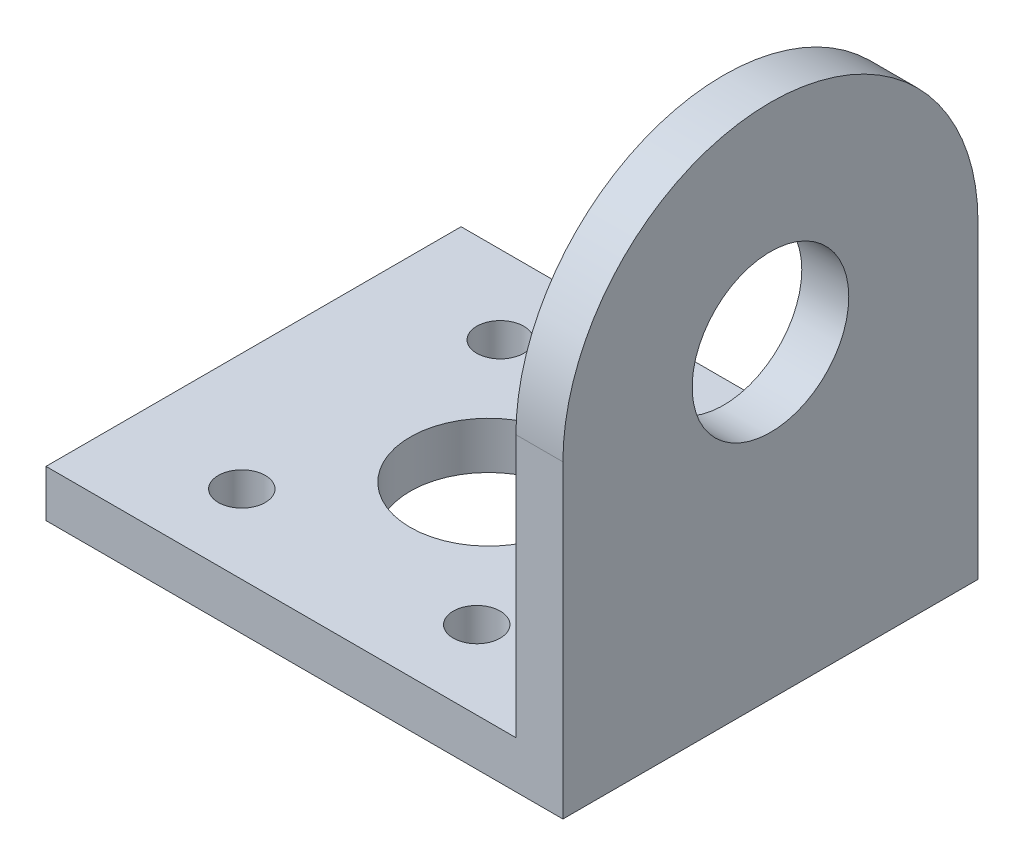
ISO-10303-21;
HEADER;
FILE_DESCRIPTION(('STEP AP214'),'2;1');
FILE_NAME('part.step','',(''),(''),'','','');
FILE_SCHEMA(('AUTOMOTIVE_DESIGN { 1 0 10303 214 1 1 1 1 }'));
ENDSEC;
DATA;
#1=APPLICATION_CONTEXT('core data for automotive mechanical design processes');
#2=APPLICATION_PROTOCOL_DEFINITION('international standard','automotive_design',2000,#1);
#3=PRODUCT_CONTEXT('',#1,'mechanical');
#4=PRODUCT('Part','Part','',(#3));
#5=PRODUCT_RELATED_PRODUCT_CATEGORY('part','',(#4));
#6=PRODUCT_DEFINITION_FORMATION('','',#4);
#7=PRODUCT_DEFINITION_CONTEXT('part definition',#1,'design');
#8=PRODUCT_DEFINITION('design','',#6,#7);
#9=PRODUCT_DEFINITION_SHAPE('','',#8);
#10=(LENGTH_UNIT() NAMED_UNIT(*) SI_UNIT(.MILLI.,.METRE.));
#11=(NAMED_UNIT(*) PLANE_ANGLE_UNIT() SI_UNIT($,.RADIAN.));
#12=(NAMED_UNIT(*) SI_UNIT($,.STERADIAN.) SOLID_ANGLE_UNIT());
#13=UNCERTAINTY_MEASURE_WITH_UNIT(LENGTH_MEASURE(1.E-05),#10,'distance_accuracy_value','');
#14=(GEOMETRIC_REPRESENTATION_CONTEXT(3) GLOBAL_UNCERTAINTY_ASSIGNED_CONTEXT((#13)) GLOBAL_UNIT_ASSIGNED_CONTEXT((#10,
#11,#12)) REPRESENTATION_CONTEXT('',''));
#15=CARTESIAN_POINT('',(0.,0.,0.));
#16=DIRECTION('',(0.,0.,1.));
#17=DIRECTION('',(1.,0.,0.));
#18=AXIS2_PLACEMENT_3D('',#15,#16,#17);
#19=CARTESIAN_POINT('',(18.,33.,-13.25));
#20=DIRECTION('',(-1.,0.,0.));
#21=DIRECTION('',(0.,0.,1.));
#22=AXIS2_PLACEMENT_3D('',#19,#20,#21);
#23=PLANE('',#22);
#24=CARTESIAN_POINT('',(18.,19.75,0.));
#25=DIRECTION('',(1.,0.,0.));
#26=DIRECTION('',(0.,0.,-1.));
#27=AXIS2_PLACEMENT_3D('',#24,#25,#26);
#28=CIRCLE('',#27,5.);
#29=CARTESIAN_POINT('',(18.,19.75,-5.));
#30=VERTEX_POINT('',#29);
#31=EDGE_CURVE('E324',#30,#30,#28,.T.);
#32=ORIENTED_EDGE('',*,*,#31,.F.);
#33=EDGE_LOOP('',(#32));
#34=FACE_BOUND('',#33,.T.);
#35=CARTESIAN_POINT('',(18.,19.75,0.));
#36=DIRECTION('',(-1.,0.,0.));
#37=DIRECTION('',(0.,0.,1.));
#38=AXIS2_PLACEMENT_3D('',#35,#36,#37);
#39=CIRCLE('',#38,13.25);
#40=CARTESIAN_POINT('',(18.,19.75,13.25));
#41=VERTEX_POINT('',#40);
#42=CARTESIAN_POINT('',(18.,19.75,-13.25));
#43=VERTEX_POINT('',#42);
#44=EDGE_CURVE('E54',#41,#43,#39,.T.);
#45=ORIENTED_EDGE('',*,*,#44,.F.);
#46=DIRECTION('',(0.,-1.,0.));
#47=VECTOR('',#46,1.);
#48=CARTESIAN_POINT('',(18.,33.,13.25));
#49=LINE('',#48,#47);
#50=CARTESIAN_POINT('',(18.,0.,13.25));
#51=VERTEX_POINT('',#50);
#52=EDGE_CURVE('E116',#41,#51,#49,.T.);
#53=ORIENTED_EDGE('',*,*,#52,.T.);
#54=DIRECTION('',(0.,0.,-1.));
#55=VECTOR('',#54,1.);
#56=CARTESIAN_POINT('',(18.,0.,-13.25));
#57=LINE('',#56,#55);
#58=CARTESIAN_POINT('',(18.,0.,-13.25));
#59=VERTEX_POINT('',#58);
#60=EDGE_CURVE('E172',#51,#59,#57,.T.);
#61=ORIENTED_EDGE('',*,*,#60,.T.);
#62=DIRECTION('',(0.,-1.,0.));
#63=VECTOR('',#62,1.);
#64=CARTESIAN_POINT('',(18.,33.,-13.25));
#65=LINE('',#64,#63);
#66=EDGE_CURVE('E127',#43,#59,#65,.T.);
#67=ORIENTED_EDGE('',*,*,#66,.F.);
#68=EDGE_LOOP('',(#45,#53,#61,#67));
#69=FACE_BOUND('',#68,.T.);
#70=ADVANCED_FACE('F39',(#34,#69),#23,.F.);
#71=CARTESIAN_POINT('',(-15.,3.,-13.25));
#72=DIRECTION('',(0.,0.,1.));
#73=DIRECTION('',(1.,0.,0.));
#74=AXIS2_PLACEMENT_3D('',#71,#72,#73);
#75=PLANE('',#74);
#76=DIRECTION('',(-1.,0.,0.));
#77=VECTOR('',#76,1.);
#78=CARTESIAN_POINT('',(48.,19.75,-13.25));
#79=LINE('',#78,#77);
#80=CARTESIAN_POINT('',(15.,19.75,-13.25));
#81=VERTEX_POINT('',#80);
#82=EDGE_CURVE('E108',#43,#81,#79,.T.);
#83=ORIENTED_EDGE('',*,*,#82,.F.);
#84=ORIENTED_EDGE('',*,*,#66,.T.);
#85=DIRECTION('',(-1.,0.,0.));
#86=VECTOR('',#85,1.);
#87=CARTESIAN_POINT('',(-15.,0.,-13.25));
#88=LINE('',#87,#86);
#89=CARTESIAN_POINT('',(-15.,0.,-13.25));
#90=VERTEX_POINT('',#89);
#91=EDGE_CURVE('E152',#59,#90,#88,.T.);
#92=ORIENTED_EDGE('',*,*,#91,.T.);
#93=DIRECTION('',(0.,-1.,0.));
#94=VECTOR('',#93,1.);
#95=CARTESIAN_POINT('',(-15.,3.,-13.25));
#96=LINE('',#95,#94);
#97=CARTESIAN_POINT('',(-15.,3.,-13.25));
#98=VERTEX_POINT('',#97);
#99=EDGE_CURVE('E11',#98,#90,#96,.T.);
#100=ORIENTED_EDGE('',*,*,#99,.F.);
#101=DIRECTION('',(-1.,0.,0.));
#102=VECTOR('',#101,1.);
#103=CARTESIAN_POINT('',(-15.,3.,-13.25));
#104=LINE('',#103,#102);
#105=CARTESIAN_POINT('',(15.,3.,-13.25));
#106=VERTEX_POINT('',#105);
#107=EDGE_CURVE('E159',#106,#98,#104,.T.);
#108=ORIENTED_EDGE('',*,*,#107,.F.);
#109=DIRECTION('',(0.,-1.,0.));
#110=VECTOR('',#109,1.);
#111=CARTESIAN_POINT('',(15.,33.,-13.25));
#112=LINE('',#111,#110);
#113=EDGE_CURVE('E81',#81,#106,#112,.T.);
#114=ORIENTED_EDGE('',*,*,#113,.F.);
#115=EDGE_LOOP('',(#83,#84,#92,#100,#108,#114));
#116=FACE_BOUND('',#115,.T.);
#117=ADVANCED_FACE('F41',(#116),#75,.F.);
#118=CARTESIAN_POINT('',(0.,3.,0.));
#119=DIRECTION('',(0.,1.,0.));
#120=DIRECTION('',(0.,0.,1.));
#121=AXIS2_PLACEMENT_3D('',#118,#119,#120);
#122=PLANE('',#121);
#123=CARTESIAN_POINT('',(-7.5,3.,8.25000000000002));
#124=DIRECTION('',(0.,1.,0.));
#125=DIRECTION('',(0.,0.,1.));
#126=AXIS2_PLACEMENT_3D('',#123,#124,#125);
#127=CIRCLE('',#126,1.5);
#128=CARTESIAN_POINT('',(-7.5,3.,9.75000000000002));
#129=VERTEX_POINT('',#128);
#130=EDGE_CURVE('E131',#129,#129,#127,.T.);
#131=ORIENTED_EDGE('',*,*,#130,.F.);
#132=EDGE_LOOP('',(#131));
#133=FACE_BOUND('',#132,.T.);
#134=CARTESIAN_POINT('',(7.49999999999999,3.,-8.25));
#135=DIRECTION('',(0.,1.,0.));
#136=DIRECTION('',(0.,0.,1.));
#137=AXIS2_PLACEMENT_3D('',#134,#135,#136);
#138=CIRCLE('',#137,1.5);
#139=CARTESIAN_POINT('',(7.49999999999999,3.,-6.75));
#140=VERTEX_POINT('',#139);
#141=EDGE_CURVE('E143',#140,#140,#138,.T.);
#142=ORIENTED_EDGE('',*,*,#141,.F.);
#143=EDGE_LOOP('',(#142));
#144=FACE_BOUND('',#143,.T.);
#145=DIRECTION('',(0.,0.,-1.));
#146=VECTOR('',#145,1.);
#147=CARTESIAN_POINT('',(15.,3.,-13.25));
#148=LINE('',#147,#146);
#149=CARTESIAN_POINT('',(15.,3.,13.25));
#150=VERTEX_POINT('',#149);
#151=EDGE_CURVE('E119',#150,#106,#148,.T.);
#152=ORIENTED_EDGE('',*,*,#151,.T.);
#153=ORIENTED_EDGE('',*,*,#107,.T.);
#154=DIRECTION('',(0.,0.,1.));
#155=VECTOR('',#154,1.);
#156=CARTESIAN_POINT('',(-15.,3.,-13.25));
#157=LINE('',#156,#155);
#158=CARTESIAN_POINT('',(-15.,3.,13.25));
#159=VERTEX_POINT('',#158);
#160=EDGE_CURVE('E61',#98,#159,#157,.T.);
#161=ORIENTED_EDGE('',*,*,#160,.T.);
#162=DIRECTION('',(1.,0.,0.));
#163=VECTOR('',#162,1.);
#164=CARTESIAN_POINT('',(-15.,3.,13.25));
#165=LINE('',#164,#163);
#166=EDGE_CURVE('E162',#159,#150,#165,.T.);
#167=ORIENTED_EDGE('',*,*,#166,.T.);
#168=EDGE_LOOP('',(#152,#153,#161,#167));
#169=FACE_BOUND('',#168,.T.);
#170=CARTESIAN_POINT('',(0.,3.,0.));
#171=DIRECTION('',(0.,1.,0.));
#172=DIRECTION('',(0.,0.,1.));
#173=AXIS2_PLACEMENT_3D('',#170,#171,#172);
#174=CIRCLE('',#173,5.);
#175=CARTESIAN_POINT('',(0.,3.,5.00000000000001));
#176=VERTEX_POINT('',#175);
#177=EDGE_CURVE('E153',#176,#176,#174,.T.);
#178=ORIENTED_EDGE('',*,*,#177,.F.);
#179=EDGE_LOOP('',(#178));
#180=FACE_BOUND('',#179,.T.);
#181=CARTESIAN_POINT('',(-7.5,3.,-8.25));
#182=DIRECTION('',(0.,1.,0.));
#183=DIRECTION('',(0.,0.,-1.));
#184=AXIS2_PLACEMENT_3D('',#181,#182,#183);
#185=CIRCLE('',#184,1.5);
#186=CARTESIAN_POINT('',(-7.5,3.,-9.75));
#187=VERTEX_POINT('',#186);
#188=EDGE_CURVE('E138',#187,#187,#185,.T.);
#189=ORIENTED_EDGE('',*,*,#188,.F.);
#190=EDGE_LOOP('',(#189));
#191=FACE_BOUND('',#190,.T.);
#192=CARTESIAN_POINT('',(7.49999999999999,3.,8.25));
#193=DIRECTION('',(0.,1.,0.));
#194=DIRECTION('',(0.,0.,-1.));
#195=AXIS2_PLACEMENT_3D('',#192,#193,#194);
#196=CIRCLE('',#195,1.5);
#197=CARTESIAN_POINT('',(7.49999999999999,3.,6.75000000000001));
#198=VERTEX_POINT('',#197);
#199=EDGE_CURVE('E121',#198,#198,#196,.T.);
#200=ORIENTED_EDGE('',*,*,#199,.F.);
#201=EDGE_LOOP('',(#200));
#202=FACE_BOUND('',#201,.T.);
#203=ADVANCED_FACE('F186',(#133,#144,#169,#180,#191,#202),#122,.T.);
#204=CARTESIAN_POINT('',(0.,0.,0.));
#205=DIRECTION('',(0.,1.,0.));
#206=DIRECTION('',(0.,0.,1.));
#207=AXIS2_PLACEMENT_3D('',#204,#205,#206);
#208=PLANE('',#207);
#209=ORIENTED_EDGE('',*,*,#91,.F.);
#210=ORIENTED_EDGE('',*,*,#60,.F.);
#211=DIRECTION('',(1.,0.,0.));
#212=VECTOR('',#211,1.);
#213=CARTESIAN_POINT('',(-15.,0.,13.25));
#214=LINE('',#213,#212);
#215=CARTESIAN_POINT('',(-15.,0.,13.25));
#216=VERTEX_POINT('',#215);
#217=EDGE_CURVE('E158',#216,#51,#214,.T.);
#218=ORIENTED_EDGE('',*,*,#217,.F.);
#219=DIRECTION('',(0.,0.,1.));
#220=VECTOR('',#219,1.);
#221=CARTESIAN_POINT('',(-15.,0.,-13.25));
#222=LINE('',#221,#220);
#223=EDGE_CURVE('E80',#90,#216,#222,.T.);
#224=ORIENTED_EDGE('',*,*,#223,.F.);
#225=EDGE_LOOP('',(#209,#210,#218,#224));
#226=FACE_BOUND('',#225,.T.);
#227=CARTESIAN_POINT('',(0.,0.,0.));
#228=DIRECTION('',(0.,1.,0.));
#229=DIRECTION('',(0.,0.,1.));
#230=AXIS2_PLACEMENT_3D('',#227,#228,#229);
#231=CIRCLE('',#230,5.);
#232=CARTESIAN_POINT('',(0.,0.,5.00000000000001));
#233=VERTEX_POINT('',#232);
#234=EDGE_CURVE('E149',#233,#233,#231,.T.);
#235=ORIENTED_EDGE('',*,*,#234,.T.);
#236=EDGE_LOOP('',(#235));
#237=FACE_BOUND('',#236,.T.);
#238=CARTESIAN_POINT('',(7.49999999999999,0.,-8.25));
#239=DIRECTION('',(0.,1.,0.));
#240=DIRECTION('',(0.,0.,1.));
#241=AXIS2_PLACEMENT_3D('',#238,#239,#240);
#242=CIRCLE('',#241,1.5);
#243=CARTESIAN_POINT('',(7.49999999999999,0.,-6.75));
#244=VERTEX_POINT('',#243);
#245=EDGE_CURVE('E145',#244,#244,#242,.T.);
#246=ORIENTED_EDGE('',*,*,#245,.T.);
#247=EDGE_LOOP('',(#246));
#248=FACE_BOUND('',#247,.T.);
#249=CARTESIAN_POINT('',(-7.5,0.,-8.25));
#250=DIRECTION('',(0.,1.,0.));
#251=DIRECTION('',(0.,0.,-1.));
#252=AXIS2_PLACEMENT_3D('',#249,#250,#251);
#253=CIRCLE('',#252,1.5);
#254=CARTESIAN_POINT('',(-7.5,0.,-9.75));
#255=VERTEX_POINT('',#254);
#256=EDGE_CURVE('E136',#255,#255,#253,.T.);
#257=ORIENTED_EDGE('',*,*,#256,.T.);
#258=EDGE_LOOP('',(#257));
#259=FACE_BOUND('',#258,.T.);
#260=CARTESIAN_POINT('',(-7.5,0.,8.25000000000002));
#261=DIRECTION('',(0.,1.,0.));
#262=DIRECTION('',(0.,0.,1.));
#263=AXIS2_PLACEMENT_3D('',#260,#261,#262);
#264=CIRCLE('',#263,1.5);
#265=CARTESIAN_POINT('',(-7.5,0.,9.75000000000002));
#266=VERTEX_POINT('',#265);
#267=EDGE_CURVE('E133',#266,#266,#264,.T.);
#268=ORIENTED_EDGE('',*,*,#267,.T.);
#269=EDGE_LOOP('',(#268));
#270=FACE_BOUND('',#269,.T.);
#271=CARTESIAN_POINT('',(7.49999999999999,0.,8.25));
#272=DIRECTION('',(0.,1.,0.));
#273=DIRECTION('',(0.,0.,-1.));
#274=AXIS2_PLACEMENT_3D('',#271,#272,#273);
#275=CIRCLE('',#274,1.5);
#276=CARTESIAN_POINT('',(7.49999999999999,0.,6.75000000000001));
#277=VERTEX_POINT('',#276);
#278=EDGE_CURVE('E122',#277,#277,#275,.T.);
#279=ORIENTED_EDGE('',*,*,#278,.T.);
#280=EDGE_LOOP('',(#279));
#281=FACE_BOUND('',#280,.T.);
#282=ADVANCED_FACE('F171',(#226,#237,#248,#259,#270,#281),#208,.F.);
#283=CARTESIAN_POINT('',(-15.,3.,-13.25));
#284=DIRECTION('',(1.,0.,0.));
#285=DIRECTION('',(0.,0.,-1.));
#286=AXIS2_PLACEMENT_3D('',#283,#284,#285);
#287=PLANE('',#286);
#288=ORIENTED_EDGE('',*,*,#223,.T.);
#289=DIRECTION('',(0.,-1.,0.));
#290=VECTOR('',#289,1.);
#291=CARTESIAN_POINT('',(-15.,3.,13.25));
#292=LINE('',#291,#290);
#293=EDGE_CURVE('E48',#159,#216,#292,.T.);
#294=ORIENTED_EDGE('',*,*,#293,.F.);
#295=ORIENTED_EDGE('',*,*,#160,.F.);
#296=ORIENTED_EDGE('',*,*,#99,.T.);
#297=EDGE_LOOP('',(#288,#294,#295,#296));
#298=FACE_BOUND('',#297,.T.);
#299=ADVANCED_FACE('F221',(#298),#287,.F.);
#300=CARTESIAN_POINT('',(-15.,3.,13.25));
#301=DIRECTION('',(0.,0.,-1.));
#302=DIRECTION('',(-1.,0.,0.));
#303=AXIS2_PLACEMENT_3D('',#300,#301,#302);
#304=PLANE('',#303);
#305=ORIENTED_EDGE('',*,*,#52,.F.);
#306=DIRECTION('',(-1.,0.,0.));
#307=VECTOR('',#306,1.);
#308=CARTESIAN_POINT('',(48.,19.75,13.25));
#309=LINE('',#308,#307);
#310=CARTESIAN_POINT('',(15.,19.75,13.25));
#311=VERTEX_POINT('',#310);
#312=EDGE_CURVE('E102',#41,#311,#309,.T.);
#313=ORIENTED_EDGE('',*,*,#312,.T.);
#314=DIRECTION('',(0.,-1.,0.));
#315=VECTOR('',#314,1.);
#316=CARTESIAN_POINT('',(15.,33.,13.25));
#317=LINE('',#316,#315);
#318=EDGE_CURVE('E112',#311,#150,#317,.T.);
#319=ORIENTED_EDGE('',*,*,#318,.T.);
#320=ORIENTED_EDGE('',*,*,#166,.F.);
#321=ORIENTED_EDGE('',*,*,#293,.T.);
#322=ORIENTED_EDGE('',*,*,#217,.T.);
#323=EDGE_LOOP('',(#305,#313,#319,#320,#321,#322));
#324=FACE_BOUND('',#323,.T.);
#325=ADVANCED_FACE('F115',(#324),#304,.F.);
#326=CARTESIAN_POINT('',(0.,3.,0.));
#327=DIRECTION('',(0.,-1.,0.));
#328=DIRECTION('',(0.,0.,-1.));
#329=AXIS2_PLACEMENT_3D('',#326,#327,#328);
#330=CYLINDRICAL_SURFACE('',#329,5.);
#331=ORIENTED_EDGE('',*,*,#177,.T.);
#332=EDGE_LOOP('',(#331));
#333=FACE_BOUND('',#332,.T.);
#334=ORIENTED_EDGE('',*,*,#234,.F.);
#335=EDGE_LOOP('',(#334));
#336=FACE_BOUND('',#335,.T.);
#337=ADVANCED_FACE('F212',(#333,#336),#330,.F.);
#338=CARTESIAN_POINT('',(7.49999999999999,3.,-8.25));
#339=DIRECTION('',(0.,-1.,0.));
#340=DIRECTION('',(0.,0.,-1.));
#341=AXIS2_PLACEMENT_3D('',#338,#339,#340);
#342=CYLINDRICAL_SURFACE('',#341,1.5);
#343=ORIENTED_EDGE('',*,*,#141,.T.);
#344=EDGE_LOOP('',(#343));
#345=FACE_BOUND('',#344,.T.);
#346=ORIENTED_EDGE('',*,*,#245,.F.);
#347=EDGE_LOOP('',(#346));
#348=FACE_BOUND('',#347,.T.);
#349=ADVANCED_FACE('F210',(#345,#348),#342,.F.);
#350=CARTESIAN_POINT('',(-7.5,3.,-8.25));
#351=DIRECTION('',(0.,-1.,0.));
#352=DIRECTION('',(0.,0.,-1.));
#353=AXIS2_PLACEMENT_3D('',#350,#351,#352);
#354=CYLINDRICAL_SURFACE('',#353,1.5);
#355=ORIENTED_EDGE('',*,*,#188,.T.);
#356=EDGE_LOOP('',(#355));
#357=FACE_BOUND('',#356,.T.);
#358=ORIENTED_EDGE('',*,*,#256,.F.);
#359=EDGE_LOOP('',(#358));
#360=FACE_BOUND('',#359,.T.);
#361=ADVANCED_FACE('F204',(#357,#360),#354,.F.);
#362=CARTESIAN_POINT('',(-7.5,3.,8.25000000000002));
#363=DIRECTION('',(0.,-1.,0.));
#364=DIRECTION('',(0.,0.,-1.));
#365=AXIS2_PLACEMENT_3D('',#362,#363,#364);
#366=CYLINDRICAL_SURFACE('',#365,1.5);
#367=ORIENTED_EDGE('',*,*,#130,.T.);
#368=EDGE_LOOP('',(#367));
#369=FACE_BOUND('',#368,.T.);
#370=ORIENTED_EDGE('',*,*,#267,.F.);
#371=EDGE_LOOP('',(#370));
#372=FACE_BOUND('',#371,.T.);
#373=ADVANCED_FACE('F197',(#369,#372),#366,.F.);
#374=CARTESIAN_POINT('',(7.49999999999999,3.,8.25));
#375=DIRECTION('',(0.,-1.,0.));
#376=DIRECTION('',(0.,0.,-1.));
#377=AXIS2_PLACEMENT_3D('',#374,#375,#376);
#378=CYLINDRICAL_SURFACE('',#377,1.5);
#379=ORIENTED_EDGE('',*,*,#199,.T.);
#380=EDGE_LOOP('',(#379));
#381=FACE_BOUND('',#380,.T.);
#382=ORIENTED_EDGE('',*,*,#278,.F.);
#383=EDGE_LOOP('',(#382));
#384=FACE_BOUND('',#383,.T.);
#385=ADVANCED_FACE('F193',(#381,#384),#378,.F.);
#386=CARTESIAN_POINT('',(15.,33.,-13.25));
#387=DIRECTION('',(1.,0.,0.));
#388=DIRECTION('',(0.,0.,-1.));
#389=AXIS2_PLACEMENT_3D('',#386,#387,#388);
#390=PLANE('',#389);
#391=CARTESIAN_POINT('',(15.,19.75,0.));
#392=DIRECTION('',(1.,0.,0.));
#393=DIRECTION('',(0.,0.,-1.));
#394=AXIS2_PLACEMENT_3D('',#391,#392,#393);
#395=CIRCLE('',#394,5.);
#396=CARTESIAN_POINT('',(15.,19.75,-5.));
#397=VERTEX_POINT('',#396);
#398=EDGE_CURVE('E43',#397,#397,#395,.T.);
#399=ORIENTED_EDGE('',*,*,#398,.T.);
#400=EDGE_LOOP('',(#399));
#401=FACE_BOUND('',#400,.T.);
#402=ORIENTED_EDGE('',*,*,#318,.F.);
#403=CARTESIAN_POINT('',(15.,19.75,0.));
#404=DIRECTION('',(-1.,0.,0.));
#405=DIRECTION('',(0.,0.,1.));
#406=AXIS2_PLACEMENT_3D('',#403,#404,#405);
#407=CIRCLE('',#406,13.25);
#408=EDGE_CURVE('E105',#311,#81,#407,.T.);
#409=ORIENTED_EDGE('',*,*,#408,.T.);
#410=ORIENTED_EDGE('',*,*,#113,.T.);
#411=ORIENTED_EDGE('',*,*,#151,.F.);
#412=EDGE_LOOP('',(#402,#409,#410,#411));
#413=FACE_BOUND('',#412,.T.);
#414=ADVANCED_FACE('F117',(#401,#413),#390,.F.);
#415=CARTESIAN_POINT('',(48.,19.75,0.));
#416=DIRECTION('',(-1.,0.,0.));
#417=DIRECTION('',(0.,0.,1.));
#418=AXIS2_PLACEMENT_3D('',#415,#416,#417);
#419=CYLINDRICAL_SURFACE('',#418,13.25);
#420=ORIENTED_EDGE('',*,*,#44,.T.);
#421=ORIENTED_EDGE('',*,*,#82,.T.);
#422=ORIENTED_EDGE('',*,*,#408,.F.);
#423=ORIENTED_EDGE('',*,*,#312,.F.);
#424=EDGE_LOOP('',(#420,#421,#422,#423));
#425=FACE_BOUND('',#424,.T.);
#426=ADVANCED_FACE('F104',(#425),#419,.T.);
#427=CARTESIAN_POINT('',(-15.,19.75,0.));
#428=DIRECTION('',(1.,0.,0.));
#429=DIRECTION('',(0.,0.,-1.));
#430=AXIS2_PLACEMENT_3D('',#427,#428,#429);
#431=CYLINDRICAL_SURFACE('',#430,5.);
#432=ORIENTED_EDGE('',*,*,#31,.T.);
#433=EDGE_LOOP('',(#432));
#434=FACE_BOUND('',#433,.T.);
#435=ORIENTED_EDGE('',*,*,#398,.F.);
#436=EDGE_LOOP('',(#435));
#437=FACE_BOUND('',#436,.T.);
#438=ADVANCED_FACE('F279',(#434,#437),#431,.F.);
#439=CLOSED_SHELL('',(#70,#117,#203,#282,#299,#325,#337,#349,#361,#373,#385,#414,#426,#438));
#440=MANIFOLD_SOLID_BREP('B2',#439);
#441=ADVANCED_BREP_SHAPE_REPRESENTATION('',(#18,#440),#14);
#442=SHAPE_DEFINITION_REPRESENTATION(#9,#441);
ENDSEC;
END-ISO-10303-21;
